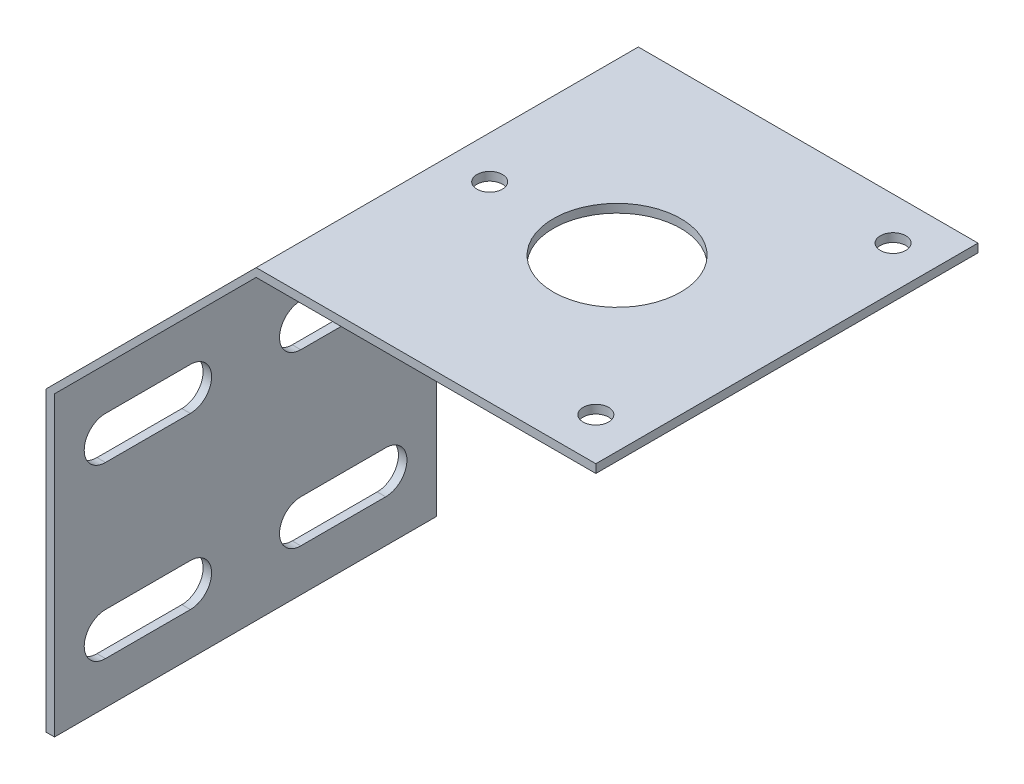
ISO-10303-21;
HEADER;
FILE_DESCRIPTION(('STEP AP214'),'2;1');
FILE_NAME('part.step','',(''),(''),'','','');
FILE_SCHEMA(('AUTOMOTIVE_DESIGN { 1 0 10303 214 1 1 1 1 }'));
ENDSEC;
DATA;
#1=APPLICATION_CONTEXT('core data for automotive mechanical design processes');
#2=APPLICATION_PROTOCOL_DEFINITION('international standard','automotive_design',2000,#1);
#3=PRODUCT_CONTEXT('',#1,'mechanical');
#4=PRODUCT('Part','Part','',(#3));
#5=PRODUCT_RELATED_PRODUCT_CATEGORY('part','',(#4));
#6=PRODUCT_DEFINITION_FORMATION('','',#4);
#7=PRODUCT_DEFINITION_CONTEXT('part definition',#1,'design');
#8=PRODUCT_DEFINITION('design','',#6,#7);
#9=PRODUCT_DEFINITION_SHAPE('','',#8);
#10=(LENGTH_UNIT() NAMED_UNIT(*) SI_UNIT(.MILLI.,.METRE.));
#11=(NAMED_UNIT(*) PLANE_ANGLE_UNIT() SI_UNIT($,.RADIAN.));
#12=(NAMED_UNIT(*) SI_UNIT($,.STERADIAN.) SOLID_ANGLE_UNIT());
#13=UNCERTAINTY_MEASURE_WITH_UNIT(LENGTH_MEASURE(1.E-05),#10,'distance_accuracy_value','');
#14=(GEOMETRIC_REPRESENTATION_CONTEXT(3) GLOBAL_UNCERTAINTY_ASSIGNED_CONTEXT((#13)) GLOBAL_UNIT_ASSIGNED_CONTEXT((#10,
#11,#12)) REPRESENTATION_CONTEXT('',''));
#15=CARTESIAN_POINT('',(0.,0.,0.));
#16=DIRECTION('',(0.,0.,1.));
#17=DIRECTION('',(1.,0.,0.));
#18=AXIS2_PLACEMENT_3D('',#15,#16,#17);
#19=CARTESIAN_POINT('',(2.,0.,90.));
#20=DIRECTION('',(0.,1.,0.));
#21=DIRECTION('',(0.,0.,1.));
#22=AXIS2_PLACEMENT_3D('',#19,#20,#21);
#23=PLANE('',#22);
#24=DIRECTION('',(1.,0.,0.));
#25=VECTOR('',#24,1.);
#26=CARTESIAN_POINT('',(2.,0.,0.));
#27=LINE('',#26,#25);
#28=CARTESIAN_POINT('',(0.,0.,0.));
#29=VERTEX_POINT('',#28);
#30=CARTESIAN_POINT('',(2.,0.,0.));
#31=VERTEX_POINT('',#30);
#32=EDGE_CURVE('E335',#29,#31,#27,.T.);
#33=ORIENTED_EDGE('',*,*,#32,.T.);
#34=DIRECTION('',(0.,0.,-1.));
#35=VECTOR('',#34,1.);
#36=CARTESIAN_POINT('',(2.,0.,90.));
#37=LINE('',#36,#35);
#38=CARTESIAN_POINT('',(2.,0.,90.));
#39=VERTEX_POINT('',#38);
#40=EDGE_CURVE('E11',#39,#31,#37,.T.);
#41=ORIENTED_EDGE('',*,*,#40,.F.);
#42=DIRECTION('',(1.,0.,0.));
#43=VECTOR('',#42,1.);
#44=CARTESIAN_POINT('',(2.,0.,90.));
#45=LINE('',#44,#43);
#46=CARTESIAN_POINT('',(0.,0.,90.));
#47=VERTEX_POINT('',#46);
#48=EDGE_CURVE('E336',#47,#39,#45,.T.);
#49=ORIENTED_EDGE('',*,*,#48,.F.);
#50=DIRECTION('',(0.,0.,-1.));
#51=VECTOR('',#50,1.);
#52=CARTESIAN_POINT('',(0.,0.,90.));
#53=LINE('',#52,#51);
#54=EDGE_CURVE('E354',#47,#29,#53,.T.);
#55=ORIENTED_EDGE('',*,*,#54,.T.);
#56=EDGE_LOOP('',(#33,#41,#49,#55));
#57=FACE_BOUND('',#56,.T.);
#58=ADVANCED_FACE('F33',(#57),#23,.F.);
#59=CARTESIAN_POINT('',(2.,70.,90.));
#60=DIRECTION('',(-1.,0.,0.));
#61=DIRECTION('',(0.,0.,1.));
#62=AXIS2_PLACEMENT_3D('',#59,#60,#61);
#63=PLANE('',#62);
#64=DIRECTION('',(0.,0.,1.));
#65=VECTOR('',#64,1.);
#66=CARTESIAN_POINT('',(2.,20.,12.));
#67=LINE('',#66,#65);
#68=CARTESIAN_POINT('',(2.,20.,12.));
#69=VERTEX_POINT('',#68);
#70=CARTESIAN_POINT('',(2.,20.,32.));
#71=VERTEX_POINT('',#70);
#72=EDGE_CURVE('E230',#69,#71,#67,.T.);
#73=ORIENTED_EDGE('',*,*,#72,.F.);
#74=CARTESIAN_POINT('',(2.,15.,12.));
#75=DIRECTION('',(-1.,0.,0.));
#76=DIRECTION('',(0.,0.,1.));
#77=AXIS2_PLACEMENT_3D('',#74,#75,#76);
#78=CIRCLE('',#77,5.);
#79=CARTESIAN_POINT('',(2.,10.,12.));
#80=VERTEX_POINT('',#79);
#81=EDGE_CURVE('E233',#80,#69,#78,.F.);
#82=ORIENTED_EDGE('',*,*,#81,.F.);
#83=DIRECTION('',(0.,0.,-1.));
#84=VECTOR('',#83,1.);
#85=CARTESIAN_POINT('',(2.,10.,12.));
#86=LINE('',#85,#84);
#87=CARTESIAN_POINT('',(2.,10.,32.));
#88=VERTEX_POINT('',#87);
#89=EDGE_CURVE('E235',#88,#80,#86,.T.);
#90=ORIENTED_EDGE('',*,*,#89,.F.);
#91=CARTESIAN_POINT('',(2.,15.,32.));
#92=DIRECTION('',(-1.,0.,0.));
#93=DIRECTION('',(0.,0.,1.));
#94=AXIS2_PLACEMENT_3D('',#91,#92,#93);
#95=CIRCLE('',#94,5.);
#96=EDGE_CURVE('E228',#71,#88,#95,.F.);
#97=ORIENTED_EDGE('',*,*,#96,.F.);
#98=EDGE_LOOP('',(#73,#82,#90,#97));
#99=FACE_BOUND('',#98,.T.);
#100=DIRECTION('',(0.,0.,1.));
#101=VECTOR('',#100,1.);
#102=CARTESIAN_POINT('',(2.,60.,58.));
#103=LINE('',#102,#101);
#104=CARTESIAN_POINT('',(2.,60.,58.));
#105=VERTEX_POINT('',#104);
#106=CARTESIAN_POINT('',(2.,60.,78.));
#107=VERTEX_POINT('',#106);
#108=EDGE_CURVE('E735',#105,#107,#103,.T.);
#109=ORIENTED_EDGE('',*,*,#108,.F.);
#110=CARTESIAN_POINT('',(2.,55.,58.));
#111=DIRECTION('',(-1.,0.,0.));
#112=DIRECTION('',(0.,0.,1.));
#113=AXIS2_PLACEMENT_3D('',#110,#111,#112);
#114=CIRCLE('',#113,5.);
#115=CARTESIAN_POINT('',(2.,50.,58.));
#116=VERTEX_POINT('',#115);
#117=EDGE_CURVE('E227',#116,#105,#114,.F.);
#118=ORIENTED_EDGE('',*,*,#117,.F.);
#119=DIRECTION('',(0.,0.,-1.));
#120=VECTOR('',#119,1.);
#121=CARTESIAN_POINT('',(2.,50.,58.));
#122=LINE('',#121,#120);
#123=CARTESIAN_POINT('',(2.,50.,78.));
#124=VERTEX_POINT('',#123);
#125=EDGE_CURVE('E224',#124,#116,#122,.T.);
#126=ORIENTED_EDGE('',*,*,#125,.F.);
#127=CARTESIAN_POINT('',(2.,55.,78.));
#128=DIRECTION('',(-1.,0.,0.));
#129=DIRECTION('',(0.,0.,1.));
#130=AXIS2_PLACEMENT_3D('',#127,#128,#129);
#131=CIRCLE('',#130,5.);
#132=EDGE_CURVE('E198',#107,#124,#131,.F.);
#133=ORIENTED_EDGE('',*,*,#132,.F.);
#134=EDGE_LOOP('',(#109,#118,#126,#133));
#135=FACE_BOUND('',#134,.T.);
#136=DIRECTION('',(0.,0.,1.));
#137=VECTOR('',#136,1.);
#138=CARTESIAN_POINT('',(2.,20.,58.));
#139=LINE('',#138,#137);
#140=CARTESIAN_POINT('',(2.,20.,58.));
#141=VERTEX_POINT('',#140);
#142=CARTESIAN_POINT('',(2.,20.,78.));
#143=VERTEX_POINT('',#142);
#144=EDGE_CURVE('E257',#141,#143,#139,.T.);
#145=ORIENTED_EDGE('',*,*,#144,.F.);
#146=CARTESIAN_POINT('',(2.,15.,58.));
#147=DIRECTION('',(-1.,0.,0.));
#148=DIRECTION('',(0.,0.,1.));
#149=AXIS2_PLACEMENT_3D('',#146,#147,#148);
#150=CIRCLE('',#149,5.);
#151=CARTESIAN_POINT('',(2.,10.,58.));
#152=VERTEX_POINT('',#151);
#153=EDGE_CURVE('E260',#152,#141,#150,.F.);
#154=ORIENTED_EDGE('',*,*,#153,.F.);
#155=DIRECTION('',(0.,0.,-1.));
#156=VECTOR('',#155,1.);
#157=CARTESIAN_POINT('',(2.,10.,58.));
#158=LINE('',#157,#156);
#159=CARTESIAN_POINT('',(2.,9.99999999999999,78.));
#160=VERTEX_POINT('',#159);
#161=EDGE_CURVE('E262',#160,#152,#158,.T.);
#162=ORIENTED_EDGE('',*,*,#161,.F.);
#163=CARTESIAN_POINT('',(2.,15.,78.));
#164=DIRECTION('',(-1.,0.,0.));
#165=DIRECTION('',(0.,0.,1.));
#166=AXIS2_PLACEMENT_3D('',#163,#164,#165);
#167=CIRCLE('',#166,5.);
#168=EDGE_CURVE('E254',#143,#160,#167,.F.);
#169=ORIENTED_EDGE('',*,*,#168,.F.);
#170=EDGE_LOOP('',(#145,#154,#162,#169));
#171=FACE_BOUND('',#170,.T.);
#172=DIRECTION('',(0.,0.,1.));
#173=VECTOR('',#172,1.);
#174=CARTESIAN_POINT('',(2.,60.,12.));
#175=LINE('',#174,#173);
#176=CARTESIAN_POINT('',(2.,60.,12.));
#177=VERTEX_POINT('',#176);
#178=CARTESIAN_POINT('',(2.,60.,32.));
#179=VERTEX_POINT('',#178);
#180=EDGE_CURVE('E286',#177,#179,#175,.T.);
#181=ORIENTED_EDGE('',*,*,#180,.F.);
#182=CARTESIAN_POINT('',(2.,55.,12.));
#183=DIRECTION('',(-1.,0.,0.));
#184=DIRECTION('',(0.,0.,1.));
#185=AXIS2_PLACEMENT_3D('',#182,#183,#184);
#186=CIRCLE('',#185,5.00000000000002);
#187=CARTESIAN_POINT('',(2.,50.,12.));
#188=VERTEX_POINT('',#187);
#189=EDGE_CURVE('E289',#188,#177,#186,.F.);
#190=ORIENTED_EDGE('',*,*,#189,.F.);
#191=DIRECTION('',(0.,0.,-1.));
#192=VECTOR('',#191,1.);
#193=CARTESIAN_POINT('',(2.,50.,12.));
#194=LINE('',#193,#192);
#195=CARTESIAN_POINT('',(2.,50.,32.));
#196=VERTEX_POINT('',#195);
#197=EDGE_CURVE('E291',#196,#188,#194,.T.);
#198=ORIENTED_EDGE('',*,*,#197,.F.);
#199=CARTESIAN_POINT('',(2.,55.,32.));
#200=DIRECTION('',(-1.,0.,0.));
#201=DIRECTION('',(0.,0.,1.));
#202=AXIS2_PLACEMENT_3D('',#199,#200,#201);
#203=CIRCLE('',#202,5.00000000000002);
#204=EDGE_CURVE('E283',#179,#196,#203,.F.);
#205=ORIENTED_EDGE('',*,*,#204,.F.);
#206=EDGE_LOOP('',(#181,#190,#198,#205));
#207=FACE_BOUND('',#206,.T.);
#208=DIRECTION('',(0.,1.,0.));
#209=VECTOR('',#208,1.);
#210=CARTESIAN_POINT('',(2.,70.,0.));
#211=LINE('',#210,#209);
#212=CARTESIAN_POINT('',(2.,70.,0.));
#213=VERTEX_POINT('',#212);
#214=EDGE_CURVE('E357',#31,#213,#211,.T.);
#215=ORIENTED_EDGE('',*,*,#214,.T.);
#216=DIRECTION('',(0.,0.,-1.));
#217=VECTOR('',#216,1.);
#218=CARTESIAN_POINT('',(2.,70.,90.));
#219=LINE('',#218,#217);
#220=CARTESIAN_POINT('',(2.,70.,90.));
#221=VERTEX_POINT('',#220);
#222=EDGE_CURVE('E40',#221,#213,#219,.T.);
#223=ORIENTED_EDGE('',*,*,#222,.F.);
#224=DIRECTION('',(0.,1.,0.));
#225=VECTOR('',#224,1.);
#226=CARTESIAN_POINT('',(2.,70.,90.));
#227=LINE('',#226,#225);
#228=EDGE_CURVE('E339',#39,#221,#227,.T.);
#229=ORIENTED_EDGE('',*,*,#228,.F.);
#230=ORIENTED_EDGE('',*,*,#40,.T.);
#231=EDGE_LOOP('',(#215,#223,#229,#230));
#232=FACE_BOUND('',#231,.T.);
#233=ADVANCED_FACE('F414',(#99,#135,#171,#207,#232),#63,.F.);
#234=CARTESIAN_POINT('',(49.4974746830584,117.497474683058,90.));
#235=DIRECTION('',(-0.707106781186547,0.707106781186548,0.));
#236=DIRECTION('',(-0.707106781186548,-0.707106781186547,0.));
#237=AXIS2_PLACEMENT_3D('',#234,#235,#236);
#238=PLANE('',#237);
#239=DIRECTION('',(0.707106781186548,0.707106781186547,0.));
#240=VECTOR('',#239,1.);
#241=CARTESIAN_POINT('',(49.4974746830584,117.497474683058,0.));
#242=LINE('',#241,#240);
#243=CARTESIAN_POINT('',(49.4974746830584,117.497474683058,0.));
#244=VERTEX_POINT('',#243);
#245=EDGE_CURVE('E359',#213,#244,#242,.T.);
#246=ORIENTED_EDGE('',*,*,#245,.T.);
#247=DIRECTION('',(0.,0.,-1.));
#248=VECTOR('',#247,1.);
#249=CARTESIAN_POINT('',(49.4974746830584,117.497474683058,90.));
#250=LINE('',#249,#248);
#251=CARTESIAN_POINT('',(49.4974746830584,117.497474683058,90.));
#252=VERTEX_POINT('',#251);
#253=EDGE_CURVE('E384',#252,#244,#250,.T.);
#254=ORIENTED_EDGE('',*,*,#253,.F.);
#255=DIRECTION('',(0.707106781186548,0.707106781186547,0.));
#256=VECTOR('',#255,1.);
#257=CARTESIAN_POINT('',(49.4974746830584,117.497474683058,90.));
#258=LINE('',#257,#256);
#259=EDGE_CURVE('E342',#221,#252,#258,.T.);
#260=ORIENTED_EDGE('',*,*,#259,.F.);
#261=ORIENTED_EDGE('',*,*,#222,.T.);
#262=EDGE_LOOP('',(#246,#254,#260,#261));
#263=FACE_BOUND('',#262,.T.);
#264=ADVANCED_FACE('F391',(#263),#238,.F.);
#265=CARTESIAN_POINT('',(129.497474683058,117.497474683058,90.));
#266=DIRECTION('',(0.,1.,0.));
#267=DIRECTION('',(0.,0.,1.));
#268=AXIS2_PLACEMENT_3D('',#265,#266,#267);
#269=PLANE('',#268);
#270=CARTESIAN_POINT('',(59.4974746830584,117.497474683058,45.));
#271=DIRECTION('',(0.,1.,0.));
#272=DIRECTION('',(0.,0.,1.));
#273=AXIS2_PLACEMENT_3D('',#270,#271,#272);
#274=CIRCLE('',#273,3.00000000000001);
#275=CARTESIAN_POINT('',(59.4974746830584,117.497474683058,48.));
#276=VERTEX_POINT('',#275);
#277=EDGE_CURVE('E315',#276,#276,#274,.F.);
#278=ORIENTED_EDGE('',*,*,#277,.F.);
#279=EDGE_LOOP('',(#278));
#280=FACE_BOUND('',#279,.T.);
#281=CARTESIAN_POINT('',(119.497474683058,117.497474683058,10.));
#282=DIRECTION('',(0.,1.,0.));
#283=DIRECTION('',(0.,0.,1.));
#284=AXIS2_PLACEMENT_3D('',#281,#282,#283);
#285=CIRCLE('',#284,3.00000000000002);
#286=CARTESIAN_POINT('',(119.497474683058,117.497474683058,13.));
#287=VERTEX_POINT('',#286);
#288=EDGE_CURVE('E316',#287,#287,#285,.F.);
#289=ORIENTED_EDGE('',*,*,#288,.F.);
#290=EDGE_LOOP('',(#289));
#291=FACE_BOUND('',#290,.T.);
#292=CARTESIAN_POINT('',(119.497474683058,117.497474683058,80.));
#293=DIRECTION('',(0.,1.,0.));
#294=DIRECTION('',(0.,0.,1.));
#295=AXIS2_PLACEMENT_3D('',#292,#293,#294);
#296=CIRCLE('',#295,3.00000000000002);
#297=CARTESIAN_POINT('',(119.497474683058,117.497474683058,83.));
#298=VERTEX_POINT('',#297);
#299=EDGE_CURVE('E323',#298,#298,#296,.F.);
#300=ORIENTED_EDGE('',*,*,#299,.F.);
#301=EDGE_LOOP('',(#300));
#302=FACE_BOUND('',#301,.T.);
#303=CARTESIAN_POINT('',(89.4974746830584,117.497474683058,45.));
#304=DIRECTION('',(0.,1.,0.));
#305=DIRECTION('',(0.,0.,1.));
#306=AXIS2_PLACEMENT_3D('',#303,#304,#305);
#307=CIRCLE('',#306,15.);
#308=CARTESIAN_POINT('',(89.4974746830584,117.497474683058,60.));
#309=VERTEX_POINT('',#308);
#310=EDGE_CURVE('E332',#309,#309,#307,.F.);
#311=ORIENTED_EDGE('',*,*,#310,.F.);
#312=EDGE_LOOP('',(#311));
#313=FACE_BOUND('',#312,.T.);
#314=DIRECTION('',(1.,0.,0.));
#315=VECTOR('',#314,1.);
#316=CARTESIAN_POINT('',(129.497474683058,117.497474683058,0.));
#317=LINE('',#316,#315);
#318=CARTESIAN_POINT('',(129.497474683058,117.497474683058,0.));
#319=VERTEX_POINT('',#318);
#320=EDGE_CURVE('E361',#244,#319,#317,.T.);
#321=ORIENTED_EDGE('',*,*,#320,.T.);
#322=DIRECTION('',(0.,0.,-1.));
#323=VECTOR('',#322,1.);
#324=CARTESIAN_POINT('',(129.497474683058,117.497474683058,90.));
#325=LINE('',#324,#323);
#326=CARTESIAN_POINT('',(129.497474683058,117.497474683058,90.));
#327=VERTEX_POINT('',#326);
#328=EDGE_CURVE('E381',#327,#319,#325,.T.);
#329=ORIENTED_EDGE('',*,*,#328,.F.);
#330=DIRECTION('',(1.,0.,0.));
#331=VECTOR('',#330,1.);
#332=CARTESIAN_POINT('',(129.497474683058,117.497474683058,90.));
#333=LINE('',#332,#331);
#334=EDGE_CURVE('E344',#252,#327,#333,.T.);
#335=ORIENTED_EDGE('',*,*,#334,.F.);
#336=ORIENTED_EDGE('',*,*,#253,.T.);
#337=EDGE_LOOP('',(#321,#329,#335,#336));
#338=FACE_BOUND('',#337,.T.);
#339=ADVANCED_FACE('F402',(#280,#291,#302,#313,#338),#269,.F.);
#340=CARTESIAN_POINT('',(129.497474683058,119.497474683058,90.));
#341=DIRECTION('',(-1.,0.,0.));
#342=DIRECTION('',(0.,0.,1.));
#343=AXIS2_PLACEMENT_3D('',#340,#341,#342);
#344=PLANE('',#343);
#345=DIRECTION('',(0.,1.,0.));
#346=VECTOR('',#345,1.);
#347=CARTESIAN_POINT('',(129.497474683058,119.497474683058,0.));
#348=LINE('',#347,#346);
#349=CARTESIAN_POINT('',(129.497474683058,119.497474683058,0.));
#350=VERTEX_POINT('',#349);
#351=EDGE_CURVE('E363',#319,#350,#348,.T.);
#352=ORIENTED_EDGE('',*,*,#351,.T.);
#353=DIRECTION('',(0.,0.,-1.));
#354=VECTOR('',#353,1.);
#355=CARTESIAN_POINT('',(129.497474683058,119.497474683058,90.));
#356=LINE('',#355,#354);
#357=CARTESIAN_POINT('',(129.497474683058,119.497474683058,90.));
#358=VERTEX_POINT('',#357);
#359=EDGE_CURVE('E378',#358,#350,#356,.T.);
#360=ORIENTED_EDGE('',*,*,#359,.F.);
#361=DIRECTION('',(0.,1.,0.));
#362=VECTOR('',#361,1.);
#363=CARTESIAN_POINT('',(129.497474683058,119.497474683058,90.));
#364=LINE('',#363,#362);
#365=EDGE_CURVE('E346',#327,#358,#364,.T.);
#366=ORIENTED_EDGE('',*,*,#365,.F.);
#367=ORIENTED_EDGE('',*,*,#328,.T.);
#368=EDGE_LOOP('',(#352,#360,#366,#367));
#369=FACE_BOUND('',#368,.T.);
#370=ADVANCED_FACE('F406',(#369),#344,.F.);
#371=CARTESIAN_POINT('',(49.4974746830584,119.497474683058,90.));
#372=DIRECTION('',(0.,-1.,0.));
#373=DIRECTION('',(0.,0.,-1.));
#374=AXIS2_PLACEMENT_3D('',#371,#372,#373);
#375=PLANE('',#374);
#376=CARTESIAN_POINT('',(59.4974746830584,119.497474683058,45.));
#377=DIRECTION('',(0.,1.,0.));
#378=DIRECTION('',(0.,0.,1.));
#379=AXIS2_PLACEMENT_3D('',#376,#377,#378);
#380=CIRCLE('',#379,3.00000000000001);
#381=CARTESIAN_POINT('',(59.4974746830584,119.497474683058,48.));
#382=VERTEX_POINT('',#381);
#383=EDGE_CURVE('E312',#382,#382,#380,.T.);
#384=ORIENTED_EDGE('',*,*,#383,.F.);
#385=EDGE_LOOP('',(#384));
#386=FACE_BOUND('',#385,.T.);
#387=CARTESIAN_POINT('',(119.497474683058,119.497474683058,10.));
#388=DIRECTION('',(0.,1.,0.));
#389=DIRECTION('',(0.,0.,1.));
#390=AXIS2_PLACEMENT_3D('',#387,#388,#389);
#391=CIRCLE('',#390,3.00000000000002);
#392=CARTESIAN_POINT('',(119.497474683058,119.497474683058,13.));
#393=VERTEX_POINT('',#392);
#394=EDGE_CURVE('E320',#393,#393,#391,.T.);
#395=ORIENTED_EDGE('',*,*,#394,.F.);
#396=EDGE_LOOP('',(#395));
#397=FACE_BOUND('',#396,.T.);
#398=CARTESIAN_POINT('',(119.497474683058,119.497474683058,80.));
#399=DIRECTION('',(0.,1.,0.));
#400=DIRECTION('',(0.,0.,1.));
#401=AXIS2_PLACEMENT_3D('',#398,#399,#400);
#402=CIRCLE('',#401,3.00000000000002);
#403=CARTESIAN_POINT('',(119.497474683058,119.497474683058,83.));
#404=VERTEX_POINT('',#403);
#405=EDGE_CURVE('E311',#404,#404,#402,.T.);
#406=ORIENTED_EDGE('',*,*,#405,.F.);
#407=EDGE_LOOP('',(#406));
#408=FACE_BOUND('',#407,.T.);
#409=CARTESIAN_POINT('',(89.4974746830584,119.497474683058,45.));
#410=DIRECTION('',(0.,1.,0.));
#411=DIRECTION('',(0.,0.,1.));
#412=AXIS2_PLACEMENT_3D('',#409,#410,#411);
#413=CIRCLE('',#412,15.);
#414=CARTESIAN_POINT('',(89.4974746830584,119.497474683058,60.));
#415=VERTEX_POINT('',#414);
#416=EDGE_CURVE('E319',#415,#415,#413,.T.);
#417=ORIENTED_EDGE('',*,*,#416,.F.);
#418=EDGE_LOOP('',(#417));
#419=FACE_BOUND('',#418,.T.);
#420=DIRECTION('',(-1.,0.,0.));
#421=VECTOR('',#420,1.);
#422=CARTESIAN_POINT('',(49.4974746830584,119.497474683058,0.));
#423=LINE('',#422,#421);
#424=CARTESIAN_POINT('',(49.4974746830584,119.497474683058,0.));
#425=VERTEX_POINT('',#424);
#426=EDGE_CURVE('E365',#350,#425,#423,.T.);
#427=ORIENTED_EDGE('',*,*,#426,.T.);
#428=DIRECTION('',(0.,0.,-1.));
#429=VECTOR('',#428,1.);
#430=CARTESIAN_POINT('',(49.4974746830584,119.497474683058,90.));
#431=LINE('',#430,#429);
#432=CARTESIAN_POINT('',(49.4974746830584,119.497474683058,90.));
#433=VERTEX_POINT('',#432);
#434=EDGE_CURVE('E375',#433,#425,#431,.T.);
#435=ORIENTED_EDGE('',*,*,#434,.F.);
#436=DIRECTION('',(-1.,0.,0.));
#437=VECTOR('',#436,1.);
#438=CARTESIAN_POINT('',(49.4974746830584,119.497474683058,90.));
#439=LINE('',#438,#437);
#440=EDGE_CURVE('E348',#358,#433,#439,.T.);
#441=ORIENTED_EDGE('',*,*,#440,.F.);
#442=ORIENTED_EDGE('',*,*,#359,.T.);
#443=EDGE_LOOP('',(#427,#435,#441,#442));
#444=FACE_BOUND('',#443,.T.);
#445=ADVANCED_FACE('F426',(#386,#397,#408,#419,#444),#375,.F.);
#446=CARTESIAN_POINT('',(0.,70.,90.));
#447=DIRECTION('',(0.707106781186547,-0.707106781186548,0.));
#448=DIRECTION('',(0.707106781186548,0.707106781186547,0.));
#449=AXIS2_PLACEMENT_3D('',#446,#447,#448);
#450=PLANE('',#449);
#451=DIRECTION('',(-0.707106781186548,-0.707106781186547,0.));
#452=VECTOR('',#451,1.);
#453=CARTESIAN_POINT('',(0.,70.,0.));
#454=LINE('',#453,#452);
#455=CARTESIAN_POINT('',(0.,70.,0.));
#456=VERTEX_POINT('',#455);
#457=EDGE_CURVE('E367',#425,#456,#454,.T.);
#458=ORIENTED_EDGE('',*,*,#457,.T.);
#459=DIRECTION('',(0.,0.,-1.));
#460=VECTOR('',#459,1.);
#461=CARTESIAN_POINT('',(0.,70.,90.));
#462=LINE('',#461,#460);
#463=CARTESIAN_POINT('',(0.,70.,90.));
#464=VERTEX_POINT('',#463);
#465=EDGE_CURVE('E372',#464,#456,#462,.T.);
#466=ORIENTED_EDGE('',*,*,#465,.F.);
#467=DIRECTION('',(-0.707106781186548,-0.707106781186547,0.));
#468=VECTOR('',#467,1.);
#469=CARTESIAN_POINT('',(0.,70.,90.));
#470=LINE('',#469,#468);
#471=EDGE_CURVE('E350',#433,#464,#470,.T.);
#472=ORIENTED_EDGE('',*,*,#471,.F.);
#473=ORIENTED_EDGE('',*,*,#434,.T.);
#474=EDGE_LOOP('',(#458,#466,#472,#473));
#475=FACE_BOUND('',#474,.T.);
#476=ADVANCED_FACE('F424',(#475),#450,.F.);
#477=CARTESIAN_POINT('',(0.,0.,90.));
#478=DIRECTION('',(1.,0.,0.));
#479=DIRECTION('',(0.,0.,-1.));
#480=AXIS2_PLACEMENT_3D('',#477,#478,#479);
#481=PLANE('',#480);
#482=DIRECTION('',(0.,0.,1.));
#483=VECTOR('',#482,1.);
#484=CARTESIAN_POINT('',(0.,10.,12.));
#485=LINE('',#484,#483);
#486=CARTESIAN_POINT('',(0.,10.,12.));
#487=VERTEX_POINT('',#486);
#488=CARTESIAN_POINT('',(0.,10.,32.));
#489=VERTEX_POINT('',#488);
#490=EDGE_CURVE('E238',#487,#489,#485,.T.);
#491=ORIENTED_EDGE('',*,*,#490,.F.);
#492=CARTESIAN_POINT('',(0.,15.,12.));
#493=DIRECTION('',(-1.,0.,0.));
#494=DIRECTION('',(0.,0.,1.));
#495=AXIS2_PLACEMENT_3D('',#492,#493,#494);
#496=CIRCLE('',#495,5.);
#497=CARTESIAN_POINT('',(0.,20.,12.));
#498=VERTEX_POINT('',#497);
#499=EDGE_CURVE('E236',#498,#487,#496,.T.);
#500=ORIENTED_EDGE('',*,*,#499,.F.);
#501=DIRECTION('',(0.,0.,-1.));
#502=VECTOR('',#501,1.);
#503=CARTESIAN_POINT('',(0.,20.,12.));
#504=LINE('',#503,#502);
#505=CARTESIAN_POINT('',(0.,20.,32.));
#506=VERTEX_POINT('',#505);
#507=EDGE_CURVE('E243',#506,#498,#504,.T.);
#508=ORIENTED_EDGE('',*,*,#507,.F.);
#509=CARTESIAN_POINT('',(0.,15.,32.));
#510=DIRECTION('',(-1.,0.,0.));
#511=DIRECTION('',(0.,0.,1.));
#512=AXIS2_PLACEMENT_3D('',#509,#510,#511);
#513=CIRCLE('',#512,5.);
#514=EDGE_CURVE('E240',#489,#506,#513,.T.);
#515=ORIENTED_EDGE('',*,*,#514,.F.);
#516=EDGE_LOOP('',(#491,#500,#508,#515));
#517=FACE_BOUND('',#516,.T.);
#518=DIRECTION('',(0.,0.,1.));
#519=VECTOR('',#518,1.);
#520=CARTESIAN_POINT('',(0.,50.,58.));
#521=LINE('',#520,#519);
#522=CARTESIAN_POINT('',(0.,50.,58.));
#523=VERTEX_POINT('',#522);
#524=CARTESIAN_POINT('',(0.,50.,78.));
#525=VERTEX_POINT('',#524);
#526=EDGE_CURVE('E205',#523,#525,#521,.T.);
#527=ORIENTED_EDGE('',*,*,#526,.F.);
#528=CARTESIAN_POINT('',(0.,55.,58.));
#529=DIRECTION('',(-1.,0.,0.));
#530=DIRECTION('',(0.,0.,1.));
#531=AXIS2_PLACEMENT_3D('',#528,#529,#530);
#532=CIRCLE('',#531,5.);
#533=CARTESIAN_POINT('',(0.,60.,58.));
#534=VERTEX_POINT('',#533);
#535=EDGE_CURVE('E210',#534,#523,#532,.T.);
#536=ORIENTED_EDGE('',*,*,#535,.F.);
#537=DIRECTION('',(0.,0.,-1.));
#538=VECTOR('',#537,1.);
#539=CARTESIAN_POINT('',(0.,60.,58.));
#540=LINE('',#539,#538);
#541=CARTESIAN_POINT('',(0.,60.,78.));
#542=VERTEX_POINT('',#541);
#543=EDGE_CURVE('E215',#542,#534,#540,.T.);
#544=ORIENTED_EDGE('',*,*,#543,.F.);
#545=CARTESIAN_POINT('',(0.,55.,78.));
#546=DIRECTION('',(-1.,0.,0.));
#547=DIRECTION('',(0.,0.,1.));
#548=AXIS2_PLACEMENT_3D('',#545,#546,#547);
#549=CIRCLE('',#548,5.);
#550=EDGE_CURVE('E195',#525,#542,#549,.T.);
#551=ORIENTED_EDGE('',*,*,#550,.F.);
#552=EDGE_LOOP('',(#527,#536,#544,#551));
#553=FACE_BOUND('',#552,.T.);
#554=DIRECTION('',(0.,0.,1.));
#555=VECTOR('',#554,1.);
#556=CARTESIAN_POINT('',(0.,10.,58.));
#557=LINE('',#556,#555);
#558=CARTESIAN_POINT('',(0.,10.,58.));
#559=VERTEX_POINT('',#558);
#560=CARTESIAN_POINT('',(0.,10.,78.));
#561=VERTEX_POINT('',#560);
#562=EDGE_CURVE('E264',#559,#561,#557,.T.);
#563=ORIENTED_EDGE('',*,*,#562,.F.);
#564=CARTESIAN_POINT('',(0.,15.,58.));
#565=DIRECTION('',(-1.,0.,0.));
#566=DIRECTION('',(0.,0.,1.));
#567=AXIS2_PLACEMENT_3D('',#564,#565,#566);
#568=CIRCLE('',#567,5.);
#569=CARTESIAN_POINT('',(0.,20.,58.));
#570=VERTEX_POINT('',#569);
#571=EDGE_CURVE('E226',#570,#559,#568,.T.);
#572=ORIENTED_EDGE('',*,*,#571,.F.);
#573=DIRECTION('',(0.,0.,-1.));
#574=VECTOR('',#573,1.);
#575=CARTESIAN_POINT('',(0.,20.,58.));
#576=LINE('',#575,#574);
#577=CARTESIAN_POINT('',(0.,20.,78.));
#578=VERTEX_POINT('',#577);
#579=EDGE_CURVE('E270',#578,#570,#576,.T.);
#580=ORIENTED_EDGE('',*,*,#579,.F.);
#581=CARTESIAN_POINT('',(0.,15.,78.));
#582=DIRECTION('',(-1.,0.,0.));
#583=DIRECTION('',(0.,0.,1.));
#584=AXIS2_PLACEMENT_3D('',#581,#582,#583);
#585=CIRCLE('',#584,5.);
#586=EDGE_CURVE('E267',#561,#578,#585,.T.);
#587=ORIENTED_EDGE('',*,*,#586,.F.);
#588=EDGE_LOOP('',(#563,#572,#580,#587));
#589=FACE_BOUND('',#588,.T.);
#590=DIRECTION('',(0.,0.,1.));
#591=VECTOR('',#590,1.);
#592=CARTESIAN_POINT('',(0.,50.,12.));
#593=LINE('',#592,#591);
#594=CARTESIAN_POINT('',(0.,50.,12.));
#595=VERTEX_POINT('',#594);
#596=CARTESIAN_POINT('',(0.,50.,32.));
#597=VERTEX_POINT('',#596);
#598=EDGE_CURVE('E293',#595,#597,#593,.T.);
#599=ORIENTED_EDGE('',*,*,#598,.F.);
#600=CARTESIAN_POINT('',(0.,55.,12.));
#601=DIRECTION('',(-1.,0.,0.));
#602=DIRECTION('',(0.,0.,1.));
#603=AXIS2_PLACEMENT_3D('',#600,#601,#602);
#604=CIRCLE('',#603,5.00000000000002);
#605=CARTESIAN_POINT('',(0.,60.,12.));
#606=VERTEX_POINT('',#605);
#607=EDGE_CURVE('E282',#606,#595,#604,.T.);
#608=ORIENTED_EDGE('',*,*,#607,.F.);
#609=DIRECTION('',(0.,0.,-1.));
#610=VECTOR('',#609,1.);
#611=CARTESIAN_POINT('',(0.,60.,12.));
#612=LINE('',#611,#610);
#613=CARTESIAN_POINT('',(0.,60.,32.));
#614=VERTEX_POINT('',#613);
#615=EDGE_CURVE('E299',#614,#606,#612,.T.);
#616=ORIENTED_EDGE('',*,*,#615,.F.);
#617=CARTESIAN_POINT('',(0.,55.,32.));
#618=DIRECTION('',(-1.,0.,0.));
#619=DIRECTION('',(0.,0.,1.));
#620=AXIS2_PLACEMENT_3D('',#617,#618,#619);
#621=CIRCLE('',#620,5.00000000000002);
#622=EDGE_CURVE('E296',#597,#614,#621,.T.);
#623=ORIENTED_EDGE('',*,*,#622,.F.);
#624=EDGE_LOOP('',(#599,#608,#616,#623));
#625=FACE_BOUND('',#624,.T.);
#626=DIRECTION('',(0.,-1.,0.));
#627=VECTOR('',#626,1.);
#628=CARTESIAN_POINT('',(0.,0.,0.));
#629=LINE('',#628,#627);
#630=EDGE_CURVE('E340',#456,#29,#629,.T.);
#631=ORIENTED_EDGE('',*,*,#630,.T.);
#632=ORIENTED_EDGE('',*,*,#54,.F.);
#633=DIRECTION('',(0.,-1.,0.));
#634=VECTOR('',#633,1.);
#635=CARTESIAN_POINT('',(0.,0.,90.));
#636=LINE('',#635,#634);
#637=EDGE_CURVE('E352',#464,#47,#636,.T.);
#638=ORIENTED_EDGE('',*,*,#637,.F.);
#639=ORIENTED_EDGE('',*,*,#465,.T.);
#640=EDGE_LOOP('',(#631,#632,#638,#639));
#641=FACE_BOUND('',#640,.T.);
#642=ADVANCED_FACE('F212',(#517,#553,#589,#625,#641),#481,.F.);
#643=CARTESIAN_POINT('',(0.,0.,90.));
#644=DIRECTION('',(0.,0.,-1.));
#645=DIRECTION('',(-1.,0.,0.));
#646=AXIS2_PLACEMENT_3D('',#643,#644,#645);
#647=PLANE('',#646);
#648=ORIENTED_EDGE('',*,*,#48,.T.);
#649=ORIENTED_EDGE('',*,*,#228,.T.);
#650=ORIENTED_EDGE('',*,*,#259,.T.);
#651=ORIENTED_EDGE('',*,*,#334,.T.);
#652=ORIENTED_EDGE('',*,*,#365,.T.);
#653=ORIENTED_EDGE('',*,*,#440,.T.);
#654=ORIENTED_EDGE('',*,*,#471,.T.);
#655=ORIENTED_EDGE('',*,*,#637,.T.);
#656=EDGE_LOOP('',(#648,#649,#650,#651,#652,#653,#654,#655));
#657=FACE_BOUND('',#656,.T.);
#658=ADVANCED_FACE('F410',(#657),#647,.F.);
#659=CARTESIAN_POINT('',(0.,0.,0.));
#660=DIRECTION('',(0.,0.,-1.));
#661=DIRECTION('',(-1.,0.,0.));
#662=AXIS2_PLACEMENT_3D('',#659,#660,#661);
#663=PLANE('',#662);
#664=ORIENTED_EDGE('',*,*,#32,.F.);
#665=ORIENTED_EDGE('',*,*,#630,.F.);
#666=ORIENTED_EDGE('',*,*,#457,.F.);
#667=ORIENTED_EDGE('',*,*,#426,.F.);
#668=ORIENTED_EDGE('',*,*,#351,.F.);
#669=ORIENTED_EDGE('',*,*,#320,.F.);
#670=ORIENTED_EDGE('',*,*,#245,.F.);
#671=ORIENTED_EDGE('',*,*,#214,.F.);
#672=EDGE_LOOP('',(#664,#665,#666,#667,#668,#669,#670,#671));
#673=FACE_BOUND('',#672,.T.);
#674=ADVANCED_FACE('F397',(#673),#663,.T.);
#675=CARTESIAN_POINT('',(89.4974746830584,75.0710678118654,45.));
#676=DIRECTION('',(0.,1.,0.));
#677=DIRECTION('',(0.,0.,1.));
#678=AXIS2_PLACEMENT_3D('',#675,#676,#677);
#679=CYLINDRICAL_SURFACE('',#678,15.);
#680=ORIENTED_EDGE('',*,*,#310,.T.);
#681=EDGE_LOOP('',(#680));
#682=FACE_BOUND('',#681,.T.);
#683=ORIENTED_EDGE('',*,*,#416,.T.);
#684=EDGE_LOOP('',(#683));
#685=FACE_BOUND('',#684,.T.);
#686=ADVANCED_FACE('F462',(#682,#685),#679,.F.);
#687=CARTESIAN_POINT('',(119.497474683058,75.0710678118654,80.));
#688=DIRECTION('',(0.,1.,0.));
#689=DIRECTION('',(0.,0.,1.));
#690=AXIS2_PLACEMENT_3D('',#687,#688,#689);
#691=CYLINDRICAL_SURFACE('',#690,3.00000000000002);
#692=ORIENTED_EDGE('',*,*,#299,.T.);
#693=EDGE_LOOP('',(#692));
#694=FACE_BOUND('',#693,.T.);
#695=ORIENTED_EDGE('',*,*,#405,.T.);
#696=EDGE_LOOP('',(#695));
#697=FACE_BOUND('',#696,.T.);
#698=ADVANCED_FACE('F465',(#694,#697),#691,.F.);
#699=CARTESIAN_POINT('',(119.497474683058,75.0710678118654,10.));
#700=DIRECTION('',(0.,1.,0.));
#701=DIRECTION('',(0.,0.,1.));
#702=AXIS2_PLACEMENT_3D('',#699,#700,#701);
#703=CYLINDRICAL_SURFACE('',#702,3.00000000000002);
#704=ORIENTED_EDGE('',*,*,#288,.T.);
#705=EDGE_LOOP('',(#704));
#706=FACE_BOUND('',#705,.T.);
#707=ORIENTED_EDGE('',*,*,#394,.T.);
#708=EDGE_LOOP('',(#707));
#709=FACE_BOUND('',#708,.T.);
#710=ADVANCED_FACE('F473',(#706,#709),#703,.F.);
#711=CARTESIAN_POINT('',(59.4974746830584,75.0710678118654,45.));
#712=DIRECTION('',(0.,1.,0.));
#713=DIRECTION('',(0.,0.,1.));
#714=AXIS2_PLACEMENT_3D('',#711,#712,#713);
#715=CYLINDRICAL_SURFACE('',#714,3.00000000000001);
#716=ORIENTED_EDGE('',*,*,#277,.T.);
#717=EDGE_LOOP('',(#716));
#718=FACE_BOUND('',#717,.T.);
#719=ORIENTED_EDGE('',*,*,#383,.T.);
#720=EDGE_LOOP('',(#719));
#721=FACE_BOUND('',#720,.T.);
#722=ADVANCED_FACE('F546',(#718,#721),#715,.F.);
#723=CARTESIAN_POINT('',(33.6227766016838,55.,12.));
#724=DIRECTION('',(-1.,0.,0.));
#725=DIRECTION('',(0.,0.,1.));
#726=AXIS2_PLACEMENT_3D('',#723,#724,#725);
#727=CYLINDRICAL_SURFACE('',#726,5.00000000000002);
#728=ORIENTED_EDGE('',*,*,#189,.T.);
#729=DIRECTION('',(-1.,0.,0.));
#730=VECTOR('',#729,1.);
#731=CARTESIAN_POINT('',(33.6227766016838,60.,12.));
#732=LINE('',#731,#730);
#733=EDGE_CURVE('E287',#177,#606,#732,.T.);
#734=ORIENTED_EDGE('',*,*,#733,.T.);
#735=ORIENTED_EDGE('',*,*,#607,.T.);
#736=DIRECTION('',(-1.,0.,0.));
#737=VECTOR('',#736,1.);
#738=CARTESIAN_POINT('',(33.6227766016838,50.,12.));
#739=LINE('',#738,#737);
#740=EDGE_CURVE('E302',#188,#595,#739,.T.);
#741=ORIENTED_EDGE('',*,*,#740,.F.);
#742=EDGE_LOOP('',(#728,#734,#735,#741));
#743=FACE_BOUND('',#742,.T.);
#744=ADVANCED_FACE('F536',(#743),#727,.F.);
#745=CARTESIAN_POINT('',(33.6227766016838,60.,12.));
#746=DIRECTION('',(0.,1.,0.));
#747=DIRECTION('',(0.,0.,1.));
#748=AXIS2_PLACEMENT_3D('',#745,#746,#747);
#749=PLANE('',#748);
#750=ORIENTED_EDGE('',*,*,#180,.T.);
#751=DIRECTION('',(-1.,0.,0.));
#752=VECTOR('',#751,1.);
#753=CARTESIAN_POINT('',(33.6227766016838,60.,32.));
#754=LINE('',#753,#752);
#755=EDGE_CURVE('E304',#179,#614,#754,.T.);
#756=ORIENTED_EDGE('',*,*,#755,.T.);
#757=ORIENTED_EDGE('',*,*,#615,.T.);
#758=ORIENTED_EDGE('',*,*,#733,.F.);
#759=EDGE_LOOP('',(#750,#756,#757,#758));
#760=FACE_BOUND('',#759,.T.);
#761=ADVANCED_FACE('F532',(#760),#749,.F.);
#762=CARTESIAN_POINT('',(33.6227766016838,55.,32.));
#763=DIRECTION('',(-1.,0.,0.));
#764=DIRECTION('',(0.,0.,1.));
#765=AXIS2_PLACEMENT_3D('',#762,#763,#764);
#766=CYLINDRICAL_SURFACE('',#765,5.00000000000002);
#767=ORIENTED_EDGE('',*,*,#204,.T.);
#768=DIRECTION('',(-1.,0.,0.));
#769=VECTOR('',#768,1.);
#770=CARTESIAN_POINT('',(33.6227766016838,50.,32.));
#771=LINE('',#770,#769);
#772=EDGE_CURVE('E306',#196,#597,#771,.T.);
#773=ORIENTED_EDGE('',*,*,#772,.T.);
#774=ORIENTED_EDGE('',*,*,#622,.T.);
#775=ORIENTED_EDGE('',*,*,#755,.F.);
#776=EDGE_LOOP('',(#767,#773,#774,#775));
#777=FACE_BOUND('',#776,.T.);
#778=ADVANCED_FACE('F535',(#777),#766,.F.);
#779=CARTESIAN_POINT('',(33.6227766016838,50.,12.));
#780=DIRECTION('',(0.,-1.,0.));
#781=DIRECTION('',(0.,0.,-1.));
#782=AXIS2_PLACEMENT_3D('',#779,#780,#781);
#783=PLANE('',#782);
#784=ORIENTED_EDGE('',*,*,#197,.T.);
#785=ORIENTED_EDGE('',*,*,#740,.T.);
#786=ORIENTED_EDGE('',*,*,#598,.T.);
#787=ORIENTED_EDGE('',*,*,#772,.F.);
#788=EDGE_LOOP('',(#784,#785,#786,#787));
#789=FACE_BOUND('',#788,.T.);
#790=ADVANCED_FACE('F530',(#789),#783,.F.);
#791=CARTESIAN_POINT('',(33.6227766016838,15.,58.));
#792=DIRECTION('',(-1.,0.,0.));
#793=DIRECTION('',(0.,0.,1.));
#794=AXIS2_PLACEMENT_3D('',#791,#792,#793);
#795=CYLINDRICAL_SURFACE('',#794,5.);
#796=ORIENTED_EDGE('',*,*,#153,.T.);
#797=DIRECTION('',(-1.,0.,0.));
#798=VECTOR('',#797,1.);
#799=CARTESIAN_POINT('',(33.6227766016838,20.,58.));
#800=LINE('',#799,#798);
#801=EDGE_CURVE('E258',#141,#570,#800,.T.);
#802=ORIENTED_EDGE('',*,*,#801,.T.);
#803=ORIENTED_EDGE('',*,*,#571,.T.);
#804=DIRECTION('',(-1.,0.,0.));
#805=VECTOR('',#804,1.);
#806=CARTESIAN_POINT('',(33.6227766016838,10.,58.));
#807=LINE('',#806,#805);
#808=EDGE_CURVE('E273',#152,#559,#807,.T.);
#809=ORIENTED_EDGE('',*,*,#808,.F.);
#810=EDGE_LOOP('',(#796,#802,#803,#809));
#811=FACE_BOUND('',#810,.T.);
#812=ADVANCED_FACE('F518',(#811),#795,.F.);
#813=CARTESIAN_POINT('',(33.6227766016838,20.,58.));
#814=DIRECTION('',(0.,1.,0.));
#815=DIRECTION('',(0.,0.,1.));
#816=AXIS2_PLACEMENT_3D('',#813,#814,#815);
#817=PLANE('',#816);
#818=ORIENTED_EDGE('',*,*,#144,.T.);
#819=DIRECTION('',(-1.,0.,0.));
#820=VECTOR('',#819,1.);
#821=CARTESIAN_POINT('',(33.6227766016838,20.,78.));
#822=LINE('',#821,#820);
#823=EDGE_CURVE('E275',#143,#578,#822,.T.);
#824=ORIENTED_EDGE('',*,*,#823,.T.);
#825=ORIENTED_EDGE('',*,*,#579,.T.);
#826=ORIENTED_EDGE('',*,*,#801,.F.);
#827=EDGE_LOOP('',(#818,#824,#825,#826));
#828=FACE_BOUND('',#827,.T.);
#829=ADVANCED_FACE('F514',(#828),#817,.F.);
#830=CARTESIAN_POINT('',(33.6227766016838,15.,78.));
#831=DIRECTION('',(-1.,0.,0.));
#832=DIRECTION('',(0.,0.,1.));
#833=AXIS2_PLACEMENT_3D('',#830,#831,#832);
#834=CYLINDRICAL_SURFACE('',#833,5.);
#835=ORIENTED_EDGE('',*,*,#168,.T.);
#836=DIRECTION('',(-1.,0.,0.));
#837=VECTOR('',#836,1.);
#838=CARTESIAN_POINT('',(33.6227766016838,10.,78.));
#839=LINE('',#838,#837);
#840=EDGE_CURVE('E277',#160,#561,#839,.T.);
#841=ORIENTED_EDGE('',*,*,#840,.T.);
#842=ORIENTED_EDGE('',*,*,#586,.T.);
#843=ORIENTED_EDGE('',*,*,#823,.F.);
#844=EDGE_LOOP('',(#835,#841,#842,#843));
#845=FACE_BOUND('',#844,.T.);
#846=ADVANCED_FACE('F517',(#845),#834,.F.);
#847=CARTESIAN_POINT('',(33.6227766016838,10.,58.));
#848=DIRECTION('',(0.,-1.,0.));
#849=DIRECTION('',(0.,0.,-1.));
#850=AXIS2_PLACEMENT_3D('',#847,#848,#849);
#851=PLANE('',#850);
#852=ORIENTED_EDGE('',*,*,#161,.T.);
#853=ORIENTED_EDGE('',*,*,#808,.T.);
#854=ORIENTED_EDGE('',*,*,#562,.T.);
#855=ORIENTED_EDGE('',*,*,#840,.F.);
#856=EDGE_LOOP('',(#852,#853,#854,#855));
#857=FACE_BOUND('',#856,.T.);
#858=ADVANCED_FACE('F522',(#857),#851,.F.);
#859=CARTESIAN_POINT('',(33.6227766016838,55.,58.));
#860=DIRECTION('',(-1.,0.,0.));
#861=DIRECTION('',(0.,0.,1.));
#862=AXIS2_PLACEMENT_3D('',#859,#860,#861);
#863=CYLINDRICAL_SURFACE('',#862,5.);
#864=ORIENTED_EDGE('',*,*,#117,.T.);
#865=DIRECTION('',(-1.,0.,0.));
#866=VECTOR('',#865,1.);
#867=CARTESIAN_POINT('',(33.6227766016838,60.,58.));
#868=LINE('',#867,#866);
#869=EDGE_CURVE('E220',#105,#534,#868,.T.);
#870=ORIENTED_EDGE('',*,*,#869,.T.);
#871=ORIENTED_EDGE('',*,*,#535,.T.);
#872=DIRECTION('',(-1.,0.,0.));
#873=VECTOR('',#872,1.);
#874=CARTESIAN_POINT('',(33.6227766016838,50.,58.));
#875=LINE('',#874,#873);
#876=EDGE_CURVE('E201',#116,#523,#875,.T.);
#877=ORIENTED_EDGE('',*,*,#876,.F.);
#878=EDGE_LOOP('',(#864,#870,#871,#877));
#879=FACE_BOUND('',#878,.T.);
#880=ADVANCED_FACE('F526',(#879),#863,.F.);
#881=CARTESIAN_POINT('',(33.6227766016838,60.,58.));
#882=DIRECTION('',(0.,1.,0.));
#883=DIRECTION('',(0.,0.,1.));
#884=AXIS2_PLACEMENT_3D('',#881,#882,#883);
#885=PLANE('',#884);
#886=ORIENTED_EDGE('',*,*,#108,.T.);
#887=DIRECTION('',(-1.,0.,0.));
#888=VECTOR('',#887,1.);
#889=CARTESIAN_POINT('',(33.6227766016838,60.,78.));
#890=LINE('',#889,#888);
#891=EDGE_CURVE('E200',#107,#542,#890,.T.);
#892=ORIENTED_EDGE('',*,*,#891,.T.);
#893=ORIENTED_EDGE('',*,*,#543,.T.);
#894=ORIENTED_EDGE('',*,*,#869,.F.);
#895=EDGE_LOOP('',(#886,#892,#893,#894));
#896=FACE_BOUND('',#895,.T.);
#897=ADVANCED_FACE('F603',(#896),#885,.F.);
#898=CARTESIAN_POINT('',(33.6227766016838,55.,78.));
#899=DIRECTION('',(-1.,0.,0.));
#900=DIRECTION('',(0.,0.,1.));
#901=AXIS2_PLACEMENT_3D('',#898,#899,#900);
#902=CYLINDRICAL_SURFACE('',#901,5.);
#903=ORIENTED_EDGE('',*,*,#132,.T.);
#904=DIRECTION('',(-1.,0.,0.));
#905=VECTOR('',#904,1.);
#906=CARTESIAN_POINT('',(33.6227766016838,50.,78.));
#907=LINE('',#906,#905);
#908=EDGE_CURVE('E55',#124,#525,#907,.T.);
#909=ORIENTED_EDGE('',*,*,#908,.T.);
#910=ORIENTED_EDGE('',*,*,#550,.T.);
#911=ORIENTED_EDGE('',*,*,#891,.F.);
#912=EDGE_LOOP('',(#903,#909,#910,#911));
#913=FACE_BOUND('',#912,.T.);
#914=ADVANCED_FACE('F192',(#913),#902,.F.);
#915=CARTESIAN_POINT('',(33.6227766016838,50.,58.));
#916=DIRECTION('',(0.,-1.,0.));
#917=DIRECTION('',(0.,0.,-1.));
#918=AXIS2_PLACEMENT_3D('',#915,#916,#917);
#919=PLANE('',#918);
#920=ORIENTED_EDGE('',*,*,#125,.T.);
#921=ORIENTED_EDGE('',*,*,#876,.T.);
#922=ORIENTED_EDGE('',*,*,#526,.T.);
#923=ORIENTED_EDGE('',*,*,#908,.F.);
#924=EDGE_LOOP('',(#920,#921,#922,#923));
#925=FACE_BOUND('',#924,.T.);
#926=ADVANCED_FACE('F206',(#925),#919,.F.);
#927=CARTESIAN_POINT('',(33.6227766016838,15.,12.));
#928=DIRECTION('',(-1.,0.,0.));
#929=DIRECTION('',(0.,0.,1.));
#930=AXIS2_PLACEMENT_3D('',#927,#928,#929);
#931=CYLINDRICAL_SURFACE('',#930,5.);
#932=ORIENTED_EDGE('',*,*,#81,.T.);
#933=DIRECTION('',(-1.,0.,0.));
#934=VECTOR('',#933,1.);
#935=CARTESIAN_POINT('',(33.6227766016838,20.,12.));
#936=LINE('',#935,#934);
#937=EDGE_CURVE('E231',#69,#498,#936,.T.);
#938=ORIENTED_EDGE('',*,*,#937,.T.);
#939=ORIENTED_EDGE('',*,*,#499,.T.);
#940=DIRECTION('',(-1.,0.,0.));
#941=VECTOR('',#940,1.);
#942=CARTESIAN_POINT('',(33.6227766016838,10.,12.));
#943=LINE('',#942,#941);
#944=EDGE_CURVE('E246',#80,#487,#943,.T.);
#945=ORIENTED_EDGE('',*,*,#944,.F.);
#946=EDGE_LOOP('',(#932,#938,#939,#945));
#947=FACE_BOUND('',#946,.T.);
#948=ADVANCED_FACE('F494',(#947),#931,.F.);
#949=CARTESIAN_POINT('',(33.6227766016838,20.,12.));
#950=DIRECTION('',(0.,1.,0.));
#951=DIRECTION('',(0.,0.,1.));
#952=AXIS2_PLACEMENT_3D('',#949,#950,#951);
#953=PLANE('',#952);
#954=ORIENTED_EDGE('',*,*,#72,.T.);
#955=DIRECTION('',(-1.,0.,0.));
#956=VECTOR('',#955,1.);
#957=CARTESIAN_POINT('',(33.6227766016838,20.,32.));
#958=LINE('',#957,#956);
#959=EDGE_CURVE('E248',#71,#506,#958,.T.);
#960=ORIENTED_EDGE('',*,*,#959,.T.);
#961=ORIENTED_EDGE('',*,*,#507,.T.);
#962=ORIENTED_EDGE('',*,*,#937,.F.);
#963=EDGE_LOOP('',(#954,#960,#961,#962));
#964=FACE_BOUND('',#963,.T.);
#965=ADVANCED_FACE('F499',(#964),#953,.F.);
#966=CARTESIAN_POINT('',(33.6227766016838,15.,32.));
#967=DIRECTION('',(-1.,0.,0.));
#968=DIRECTION('',(0.,0.,1.));
#969=AXIS2_PLACEMENT_3D('',#966,#967,#968);
#970=CYLINDRICAL_SURFACE('',#969,5.);
#971=ORIENTED_EDGE('',*,*,#96,.T.);
#972=DIRECTION('',(-1.,0.,0.));
#973=VECTOR('',#972,1.);
#974=CARTESIAN_POINT('',(33.6227766016838,10.,32.));
#975=LINE('',#974,#973);
#976=EDGE_CURVE('E47',#88,#489,#975,.T.);
#977=ORIENTED_EDGE('',*,*,#976,.T.);
#978=ORIENTED_EDGE('',*,*,#514,.T.);
#979=ORIENTED_EDGE('',*,*,#959,.F.);
#980=EDGE_LOOP('',(#971,#977,#978,#979));
#981=FACE_BOUND('',#980,.T.);
#982=ADVANCED_FACE('F501',(#981),#970,.F.);
#983=CARTESIAN_POINT('',(33.6227766016838,10.,12.));
#984=DIRECTION('',(0.,-1.,0.));
#985=DIRECTION('',(0.,0.,-1.));
#986=AXIS2_PLACEMENT_3D('',#983,#984,#985);
#987=PLANE('',#986);
#988=ORIENTED_EDGE('',*,*,#89,.T.);
#989=ORIENTED_EDGE('',*,*,#944,.T.);
#990=ORIENTED_EDGE('',*,*,#490,.T.);
#991=ORIENTED_EDGE('',*,*,#976,.F.);
#992=EDGE_LOOP('',(#988,#989,#990,#991));
#993=FACE_BOUND('',#992,.T.);
#994=ADVANCED_FACE('F489',(#993),#987,.F.);
#995=CLOSED_SHELL('',(#58,#233,#264,#339,#370,#445,#476,#642,#658,#674,#686,#698,#710,#722,#744,
#761,#778,#790,#812,#829,#846,#858,#880,#897,#914,#926,#948,#965,#982,#994));
#996=MANIFOLD_SOLID_BREP('B2',#995);
#997=ADVANCED_BREP_SHAPE_REPRESENTATION('',(#18,#996),#14);
#998=SHAPE_DEFINITION_REPRESENTATION(#9,#997);
ENDSEC;
END-ISO-10303-21;
